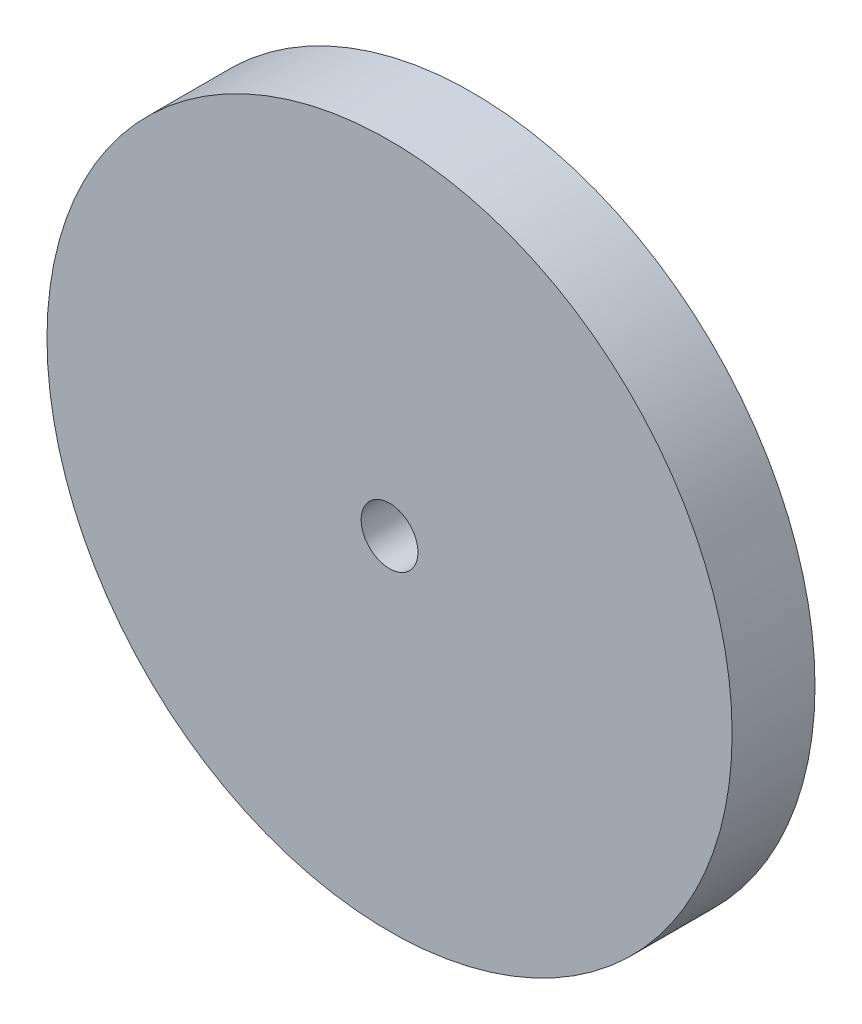
ISO-10303-21;
HEADER;
FILE_DESCRIPTION(('STEP AP214'),'2;1');
FILE_NAME('part.step','',(''),(''),'','','');
FILE_SCHEMA(('AUTOMOTIVE_DESIGN { 1 0 10303 214 1 1 1 1 }'));
ENDSEC;
DATA;
#1=APPLICATION_CONTEXT('core data for automotive mechanical design processes');
#2=APPLICATION_PROTOCOL_DEFINITION('international standard','automotive_design',2000,#1);
#3=PRODUCT_CONTEXT('',#1,'mechanical');
#4=PRODUCT('Part','Part','',(#3));
#5=PRODUCT_RELATED_PRODUCT_CATEGORY('part','',(#4));
#6=PRODUCT_DEFINITION_FORMATION('','',#4);
#7=PRODUCT_DEFINITION_CONTEXT('part definition',#1,'design');
#8=PRODUCT_DEFINITION('design','',#6,#7);
#9=PRODUCT_DEFINITION_SHAPE('','',#8);
#10=(LENGTH_UNIT() NAMED_UNIT(*) SI_UNIT(.MILLI.,.METRE.));
#11=(NAMED_UNIT(*) PLANE_ANGLE_UNIT() SI_UNIT($,.RADIAN.));
#12=(NAMED_UNIT(*) SI_UNIT($,.STERADIAN.) SOLID_ANGLE_UNIT());
#13=UNCERTAINTY_MEASURE_WITH_UNIT(LENGTH_MEASURE(1.E-05),#10,'distance_accuracy_value','');
#14=(GEOMETRIC_REPRESENTATION_CONTEXT(3) GLOBAL_UNCERTAINTY_ASSIGNED_CONTEXT((#13)) GLOBAL_UNIT_ASSIGNED_CONTEXT((#10,
#11,#12)) REPRESENTATION_CONTEXT('',''));
#15=CARTESIAN_POINT('',(0.,0.,0.));
#16=DIRECTION('',(0.,0.,1.));
#17=DIRECTION('',(1.,0.,0.));
#18=AXIS2_PLACEMENT_3D('',#15,#16,#17);
#19=CARTESIAN_POINT('',(-41.4881203663893,0.,10.6045000000001));
#20=DIRECTION('',(0.,0.,1.));
#21=DIRECTION('',(1.,0.,0.));
#22=AXIS2_PLACEMENT_3D('',#19,#20,#21);
#23=PLANE('',#22);
#24=CARTESIAN_POINT('',(-41.4881203663893,0.,10.6045000000001));
#25=DIRECTION('',(0.,0.,1.));
#26=DIRECTION('',(1.,0.,0.));
#27=AXIS2_PLACEMENT_3D('',#24,#25,#26);
#28=CIRCLE('',#27,24.145);
#29=CARTESIAN_POINT('',(-17.3431203663893,0.,10.6045000000001));
#30=VERTEX_POINT('',#29);
#31=EDGE_CURVE('E10',#30,#30,#28,.T.);
#32=ORIENTED_EDGE('',*,*,#31,.T.);
#33=EDGE_LOOP('',(#32));
#34=FACE_BOUND('',#33,.T.);
#35=CARTESIAN_POINT('',(-41.4881203663893,0.,10.6045000000001));
#36=DIRECTION('',(0.,0.,1.));
#37=DIRECTION('',(1.,0.,0.));
#38=AXIS2_PLACEMENT_3D('',#35,#36,#37);
#39=CIRCLE('',#38,2.);
#40=CARTESIAN_POINT('',(-39.4881203663893,0.,10.6045000000001));
#41=VERTEX_POINT('',#40);
#42=EDGE_CURVE('E42',#41,#41,#39,.T.);
#43=ORIENTED_EDGE('',*,*,#42,.F.);
#44=EDGE_LOOP('',(#43));
#45=FACE_BOUND('',#44,.T.);
#46=ADVANCED_FACE('F31',(#34,#45),#23,.T.);
#47=CARTESIAN_POINT('',(-41.4881203663893,0.,4.76250000000011));
#48=DIRECTION('',(0.,0.,1.));
#49=DIRECTION('',(1.,0.,0.));
#50=AXIS2_PLACEMENT_3D('',#47,#48,#49);
#51=PLANE('',#50);
#52=CARTESIAN_POINT('',(-41.4881203663893,0.,4.76250000000011));
#53=DIRECTION('',(0.,0.,1.));
#54=DIRECTION('',(1.,0.,0.));
#55=AXIS2_PLACEMENT_3D('',#52,#53,#54);
#56=CIRCLE('',#55,24.145);
#57=CARTESIAN_POINT('',(-17.3431203663893,0.,4.76250000000011));
#58=VERTEX_POINT('',#57);
#59=EDGE_CURVE('E35',#58,#58,#56,.T.);
#60=ORIENTED_EDGE('',*,*,#59,.F.);
#61=EDGE_LOOP('',(#60));
#62=FACE_BOUND('',#61,.T.);
#63=CARTESIAN_POINT('',(-41.4881203663893,0.,4.76250000000011));
#64=DIRECTION('',(0.,0.,1.));
#65=DIRECTION('',(1.,0.,0.));
#66=AXIS2_PLACEMENT_3D('',#63,#64,#65);
#67=CIRCLE('',#66,2.);
#68=CARTESIAN_POINT('',(-39.4881203663893,0.,4.76250000000011));
#69=VERTEX_POINT('',#68);
#70=EDGE_CURVE('E44',#69,#69,#67,.T.);
#71=ORIENTED_EDGE('',*,*,#70,.T.);
#72=EDGE_LOOP('',(#71));
#73=FACE_BOUND('',#72,.T.);
#74=ADVANCED_FACE('F54',(#62,#73),#51,.F.);
#75=CARTESIAN_POINT('',(-41.4881203663893,0.,10.6045000000001));
#76=DIRECTION('',(0.,0.,-1.));
#77=DIRECTION('',(-1.,0.,0.));
#78=AXIS2_PLACEMENT_3D('',#75,#76,#77);
#79=CYLINDRICAL_SURFACE('',#78,24.145);
#80=ORIENTED_EDGE('',*,*,#31,.F.);
#81=EDGE_LOOP('',(#80));
#82=FACE_BOUND('',#81,.T.);
#83=ORIENTED_EDGE('',*,*,#59,.T.);
#84=EDGE_LOOP('',(#83));
#85=FACE_BOUND('',#84,.T.);
#86=ADVANCED_FACE('F33',(#82,#85),#79,.T.);
#87=CARTESIAN_POINT('',(-41.4881203663893,0.,10.6045000000001));
#88=DIRECTION('',(0.,0.,-1.));
#89=DIRECTION('',(-1.,0.,0.));
#90=AXIS2_PLACEMENT_3D('',#87,#88,#89);
#91=CYLINDRICAL_SURFACE('',#90,2.);
#92=ORIENTED_EDGE('',*,*,#42,.T.);
#93=EDGE_LOOP('',(#92));
#94=FACE_BOUND('',#93,.T.);
#95=ORIENTED_EDGE('',*,*,#70,.F.);
#96=EDGE_LOOP('',(#95));
#97=FACE_BOUND('',#96,.T.);
#98=ADVANCED_FACE('F50',(#94,#97),#91,.F.);
#99=CLOSED_SHELL('',(#46,#74,#86,#98));
#100=MANIFOLD_SOLID_BREP('B2',#99);
#101=ADVANCED_BREP_SHAPE_REPRESENTATION('',(#18,#100),#14);
#102=SHAPE_DEFINITION_REPRESENTATION(#9,#101);
ENDSEC;
END-ISO-10303-21;
